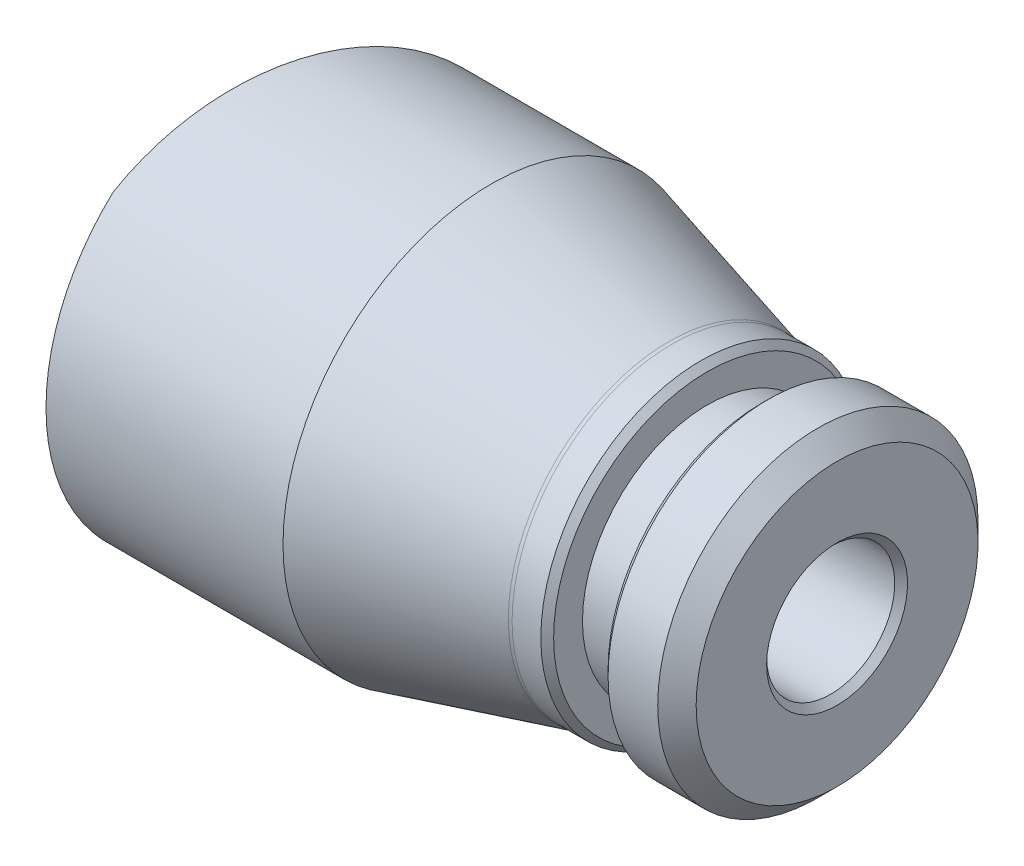
ISO-10303-21;
HEADER;
FILE_DESCRIPTION(('STEP AP214'),'2;1');
FILE_NAME('part.step','',(''),(''),'','','');
FILE_SCHEMA(('AUTOMOTIVE_DESIGN { 1 0 10303 214 1 1 1 1 }'));
ENDSEC;
DATA;
#1=APPLICATION_CONTEXT('core data for automotive mechanical design processes');
#2=APPLICATION_PROTOCOL_DEFINITION('international standard','automotive_design',2000,#1);
#3=PRODUCT_CONTEXT('',#1,'mechanical');
#4=PRODUCT('Part','Part','',(#3));
#5=PRODUCT_RELATED_PRODUCT_CATEGORY('part','',(#4));
#6=PRODUCT_DEFINITION_FORMATION('','',#4);
#7=PRODUCT_DEFINITION_CONTEXT('part definition',#1,'design');
#8=PRODUCT_DEFINITION('design','',#6,#7);
#9=PRODUCT_DEFINITION_SHAPE('','',#8);
#10=(LENGTH_UNIT() NAMED_UNIT(*) SI_UNIT(.MILLI.,.METRE.));
#11=(NAMED_UNIT(*) PLANE_ANGLE_UNIT() SI_UNIT($,.RADIAN.));
#12=(NAMED_UNIT(*) SI_UNIT($,.STERADIAN.) SOLID_ANGLE_UNIT());
#13=UNCERTAINTY_MEASURE_WITH_UNIT(LENGTH_MEASURE(1.E-05),#10,'distance_accuracy_value','');
#14=(GEOMETRIC_REPRESENTATION_CONTEXT(3) GLOBAL_UNCERTAINTY_ASSIGNED_CONTEXT((#13)) GLOBAL_UNIT_ASSIGNED_CONTEXT((#10,
#11,#12)) REPRESENTATION_CONTEXT('',''));
#15=CARTESIAN_POINT('',(0.,0.,0.));
#16=DIRECTION('',(0.,0.,1.));
#17=DIRECTION('',(1.,0.,0.));
#18=AXIS2_PLACEMENT_3D('',#15,#16,#17);
#19=CARTESIAN_POINT('',(0.,27.5,0.));
#20=DIRECTION('',(1.,0.,0.));
#21=DIRECTION('',(0.,0.,-1.));
#22=AXIS2_PLACEMENT_3D('',#19,#20,#21);
#23=PLANE('',#22);
#24=CARTESIAN_POINT('',(0.,0.,0.));
#25=DIRECTION('',(-1.,0.,0.));
#26=DIRECTION('',(0.,0.,1.));
#27=AXIS2_PLACEMENT_3D('',#24,#25,#26);
#28=CIRCLE('',#27,32.5);
#29=CARTESIAN_POINT('',(0.,-23.9217474278114,22.));
#30=VERTEX_POINT('',#29);
#31=CARTESIAN_POINT('',(0.,23.9217474278114,22.));
#32=VERTEX_POINT('',#31);
#33=EDGE_CURVE('E69',#30,#32,#28,.T.);
#34=ORIENTED_EDGE('',*,*,#33,.T.);
#35=DIRECTION('',(0.,-1.,0.));
#36=VECTOR('',#35,1.);
#37=CARTESIAN_POINT('',(0.,27.5,22.));
#38=LINE('',#37,#36);
#39=CARTESIAN_POINT('',(0.,16.5,22.));
#40=VERTEX_POINT('',#39);
#41=EDGE_CURVE('E60',#32,#40,#38,.T.);
#42=ORIENTED_EDGE('',*,*,#41,.T.);
#43=CARTESIAN_POINT('',(0.,0.,0.));
#44=DIRECTION('',(-1.,0.,0.));
#45=DIRECTION('',(0.,0.,1.));
#46=AXIS2_PLACEMENT_3D('',#43,#44,#45);
#47=CIRCLE('',#46,27.5);
#48=CARTESIAN_POINT('',(0.,-16.5,22.));
#49=VERTEX_POINT('',#48);
#50=EDGE_CURVE('E46',#49,#40,#47,.T.);
#51=ORIENTED_EDGE('',*,*,#50,.F.);
#52=EDGE_CURVE('E65',#49,#30,#38,.T.);
#53=ORIENTED_EDGE('',*,*,#52,.T.);
#54=EDGE_LOOP('',(#34,#42,#51,#53));
#55=FACE_BOUND('',#54,.T.);
#56=ADVANCED_FACE('F39',(#55),#23,.F.);
#57=CARTESIAN_POINT('',(0.,0.,0.));
#58=DIRECTION('',(-1.,0.,0.));
#59=DIRECTION('',(0.,0.,1.));
#60=AXIS2_PLACEMENT_3D('',#57,#58,#59);
#61=CYLINDRICAL_SURFACE('',#60,27.5);
#62=CARTESIAN_POINT('',(24.6,0.,0.));
#63=DIRECTION('',(-1.,0.,0.));
#64=DIRECTION('',(0.,0.,1.));
#65=AXIS2_PLACEMENT_3D('',#62,#63,#64);
#66=CIRCLE('',#65,27.5);
#67=CARTESIAN_POINT('',(24.6,0.,27.5));
#68=VERTEX_POINT('',#67);
#69=EDGE_CURVE('E132',#68,#68,#66,.T.);
#70=ORIENTED_EDGE('',*,*,#69,.F.);
#71=EDGE_LOOP('',(#70));
#72=FACE_BOUND('',#71,.T.);
#73=ORIENTED_EDGE('',*,*,#50,.T.);
#74=CARTESIAN_POINT('',(4.67624435674049,0.,0.));
#75=DIRECTION('',(0.978147600733805,0.,0.207911690817759));
#76=DIRECTION('',(-0.207911690817759,0.,0.978147600733806));
#77=AXIS2_PLACEMENT_3D('',#74,#75,#76);
#78=ELLIPSE('',#77,28.1143663587883,27.5);
#79=EDGE_CURVE('E52',#40,#49,#78,.F.);
#80=ORIENTED_EDGE('',*,*,#79,.T.);
#81=EDGE_LOOP('',(#73,#80));
#82=FACE_BOUND('',#81,.T.);
#83=ADVANCED_FACE('F131',(#72,#82),#61,.F.);
#84=CARTESIAN_POINT('',(24.6,0.,0.));
#85=DIRECTION('',(-1.,0.,0.));
#86=DIRECTION('',(0.,0.,1.));
#87=AXIS2_PLACEMENT_3D('',#84,#85,#86);
#88=TOROIDAL_SURFACE('',#87,27.1,0.399999999999999);
#89=CARTESIAN_POINT('',(25.,0.,0.));
#90=DIRECTION('',(-1.,0.,0.));
#91=DIRECTION('',(0.,0.,1.));
#92=AXIS2_PLACEMENT_3D('',#89,#90,#91);
#93=CIRCLE('',#92,27.1);
#94=CARTESIAN_POINT('',(25.,0.,27.1));
#95=VERTEX_POINT('',#94);
#96=EDGE_CURVE('E126',#95,#95,#93,.T.);
#97=ORIENTED_EDGE('',*,*,#96,.F.);
#98=EDGE_LOOP('',(#97));
#99=FACE_BOUND('',#98,.T.);
#100=ORIENTED_EDGE('',*,*,#69,.T.);
#101=EDGE_LOOP('',(#100));
#102=FACE_BOUND('',#101,.T.);
#103=ADVANCED_FACE('F137',(#99,#102),#88,.F.);
#104=CARTESIAN_POINT('',(25.,20.,0.));
#105=DIRECTION('',(1.,0.,0.));
#106=DIRECTION('',(0.,0.,-1.));
#107=AXIS2_PLACEMENT_3D('',#104,#105,#106);
#108=PLANE('',#107);
#109=CARTESIAN_POINT('',(25.,0.,0.));
#110=DIRECTION('',(-1.,0.,0.));
#111=DIRECTION('',(0.,0.,1.));
#112=AXIS2_PLACEMENT_3D('',#109,#110,#111);
#113=CIRCLE('',#112,20.);
#114=CARTESIAN_POINT('',(25.,0.,20.));
#115=VERTEX_POINT('',#114);
#116=EDGE_CURVE('E121',#115,#115,#113,.T.);
#117=ORIENTED_EDGE('',*,*,#116,.F.);
#118=EDGE_LOOP('',(#117));
#119=FACE_BOUND('',#118,.T.);
#120=ORIENTED_EDGE('',*,*,#96,.T.);
#121=EDGE_LOOP('',(#120));
#122=FACE_BOUND('',#121,.T.);
#123=ADVANCED_FACE('F141',(#119,#122),#108,.F.);
#124=CARTESIAN_POINT('',(0.,0.,0.));
#125=DIRECTION('',(-1.,0.,0.));
#126=DIRECTION('',(0.,0.,1.));
#127=AXIS2_PLACEMENT_3D('',#124,#125,#126);
#128=CYLINDRICAL_SURFACE('',#127,20.);
#129=CARTESIAN_POINT('',(60.,0.,0.));
#130=DIRECTION('',(-1.,0.,0.));
#131=DIRECTION('',(0.,0.,1.));
#132=AXIS2_PLACEMENT_3D('',#129,#130,#131);
#133=CIRCLE('',#132,20.);
#134=CARTESIAN_POINT('',(60.,0.,20.));
#135=VERTEX_POINT('',#134);
#136=EDGE_CURVE('E125',#135,#135,#133,.T.);
#137=ORIENTED_EDGE('',*,*,#136,.F.);
#138=EDGE_LOOP('',(#137));
#139=FACE_BOUND('',#138,.T.);
#140=ORIENTED_EDGE('',*,*,#116,.T.);
#141=EDGE_LOOP('',(#140));
#142=FACE_BOUND('',#141,.T.);
#143=ADVANCED_FACE('F147',(#139,#142),#128,.F.);
#144=CARTESIAN_POINT('',(60.,0.,0.));
#145=DIRECTION('',(-1.,0.,0.));
#146=DIRECTION('',(0.,0.,1.));
#147=AXIS2_PLACEMENT_3D('',#144,#145,#146);
#148=TOROIDAL_SURFACE('',#147,19.,1.);
#149=CARTESIAN_POINT('',(61.,0.,0.));
#150=DIRECTION('',(-1.,0.,0.));
#151=DIRECTION('',(0.,0.,1.));
#152=AXIS2_PLACEMENT_3D('',#149,#150,#151);
#153=CIRCLE('',#152,19.);
#154=CARTESIAN_POINT('',(61.,0.,19.));
#155=VERTEX_POINT('',#154);
#156=EDGE_CURVE('E116',#155,#155,#153,.T.);
#157=ORIENTED_EDGE('',*,*,#156,.F.);
#158=EDGE_LOOP('',(#157));
#159=FACE_BOUND('',#158,.T.);
#160=ORIENTED_EDGE('',*,*,#136,.T.);
#161=EDGE_LOOP('',(#160));
#162=FACE_BOUND('',#161,.T.);
#163=ADVANCED_FACE('F152',(#159,#162),#148,.F.);
#164=CARTESIAN_POINT('',(61.,10.,0.));
#165=DIRECTION('',(1.,0.,0.));
#166=DIRECTION('',(0.,0.,-1.));
#167=AXIS2_PLACEMENT_3D('',#164,#165,#166);
#168=PLANE('',#167);
#169=CARTESIAN_POINT('',(61.,0.,0.));
#170=DIRECTION('',(-1.,0.,0.));
#171=DIRECTION('',(0.,0.,1.));
#172=AXIS2_PLACEMENT_3D('',#169,#170,#171);
#173=CIRCLE('',#172,10.);
#174=CARTESIAN_POINT('',(61.,0.,10.));
#175=VERTEX_POINT('',#174);
#176=EDGE_CURVE('E117',#175,#175,#173,.T.);
#177=ORIENTED_EDGE('',*,*,#176,.F.);
#178=EDGE_LOOP('',(#177));
#179=FACE_BOUND('',#178,.T.);
#180=ORIENTED_EDGE('',*,*,#156,.T.);
#181=EDGE_LOOP('',(#180));
#182=FACE_BOUND('',#181,.T.);
#183=ADVANCED_FACE('F158',(#179,#182),#168,.F.);
#184=CARTESIAN_POINT('',(0.,0.,0.));
#185=DIRECTION('',(-1.,0.,0.));
#186=DIRECTION('',(0.,0.,1.));
#187=AXIS2_PLACEMENT_3D('',#184,#185,#186);
#188=CYLINDRICAL_SURFACE('',#187,10.);
#189=CARTESIAN_POINT('',(90.,0.,0.));
#190=DIRECTION('',(-1.,0.,0.));
#191=DIRECTION('',(0.,0.,1.));
#192=AXIS2_PLACEMENT_3D('',#189,#190,#191);
#193=CIRCLE('',#192,10.);
#194=CARTESIAN_POINT('',(90.,0.,10.));
#195=VERTEX_POINT('',#194);
#196=EDGE_CURVE('E114',#195,#195,#193,.T.);
#197=ORIENTED_EDGE('',*,*,#196,.F.);
#198=EDGE_LOOP('',(#197));
#199=FACE_BOUND('',#198,.T.);
#200=ORIENTED_EDGE('',*,*,#176,.T.);
#201=EDGE_LOOP('',(#200));
#202=FACE_BOUND('',#201,.T.);
#203=ADVANCED_FACE('F165',(#199,#202),#188,.F.);
#204=CARTESIAN_POINT('',(90.,0.,0.));
#205=DIRECTION('',(1.,0.,0.));
#206=DIRECTION('',(0.,0.,-1.));
#207=AXIS2_PLACEMENT_3D('',#204,#205,#206);
#208=CONICAL_SURFACE('',#207,10.,0.785398163397447);
#209=CARTESIAN_POINT('',(91.,0.,0.));
#210=DIRECTION('',(-1.,0.,0.));
#211=DIRECTION('',(0.,0.,1.));
#212=AXIS2_PLACEMENT_3D('',#209,#210,#211);
#213=CIRCLE('',#212,11.);
#214=CARTESIAN_POINT('',(91.,0.,11.));
#215=VERTEX_POINT('',#214);
#216=EDGE_CURVE('E109',#215,#215,#213,.T.);
#217=ORIENTED_EDGE('',*,*,#216,.F.);
#218=EDGE_LOOP('',(#217));
#219=FACE_BOUND('',#218,.T.);
#220=ORIENTED_EDGE('',*,*,#196,.T.);
#221=EDGE_LOOP('',(#220));
#222=FACE_BOUND('',#221,.T.);
#223=ADVANCED_FACE('F167',(#219,#222),#208,.F.);
#224=CARTESIAN_POINT('',(91.,22.,0.));
#225=DIRECTION('',(-1.,0.,0.));
#226=DIRECTION('',(0.,0.,1.));
#227=AXIS2_PLACEMENT_3D('',#224,#225,#226);
#228=PLANE('',#227);
#229=CARTESIAN_POINT('',(91.,0.,0.));
#230=DIRECTION('',(-1.,0.,0.));
#231=DIRECTION('',(0.,0.,1.));
#232=AXIS2_PLACEMENT_3D('',#229,#230,#231);
#233=CIRCLE('',#232,22.);
#234=CARTESIAN_POINT('',(91.,0.,22.));
#235=VERTEX_POINT('',#234);
#236=EDGE_CURVE('E110',#235,#235,#233,.T.);
#237=ORIENTED_EDGE('',*,*,#236,.F.);
#238=EDGE_LOOP('',(#237));
#239=FACE_BOUND('',#238,.T.);
#240=ORIENTED_EDGE('',*,*,#216,.T.);
#241=EDGE_LOOP('',(#240));
#242=FACE_BOUND('',#241,.T.);
#243=ADVANCED_FACE('F168',(#239,#242),#228,.F.);
#244=CARTESIAN_POINT('',(91.,0.,0.));
#245=DIRECTION('',(-1.,0.,0.));
#246=DIRECTION('',(0.,0.,1.));
#247=AXIS2_PLACEMENT_3D('',#244,#245,#246);
#248=CONICAL_SURFACE('',#247,22.,0.785398163397448);
#249=CARTESIAN_POINT('',(88.,0.,0.));
#250=DIRECTION('',(-1.,0.,0.));
#251=DIRECTION('',(0.,0.,1.));
#252=AXIS2_PLACEMENT_3D('',#249,#250,#251);
#253=CIRCLE('',#252,25.);
#254=CARTESIAN_POINT('',(88.,0.,25.));
#255=VERTEX_POINT('',#254);
#256=EDGE_CURVE('E102',#255,#255,#253,.T.);
#257=ORIENTED_EDGE('',*,*,#256,.F.);
#258=EDGE_LOOP('',(#257));
#259=FACE_BOUND('',#258,.T.);
#260=ORIENTED_EDGE('',*,*,#236,.T.);
#261=EDGE_LOOP('',(#260));
#262=FACE_BOUND('',#261,.T.);
#263=ADVANCED_FACE('F171',(#259,#262),#248,.T.);
#264=CARTESIAN_POINT('',(0.,0.,0.));
#265=DIRECTION('',(-1.,0.,0.));
#266=DIRECTION('',(0.,0.,1.));
#267=AXIS2_PLACEMENT_3D('',#264,#265,#266);
#268=CYLINDRICAL_SURFACE('',#267,25.);
#269=CARTESIAN_POINT('',(80.25,0.,0.));
#270=DIRECTION('',(-1.,0.,0.));
#271=DIRECTION('',(0.,0.,1.));
#272=AXIS2_PLACEMENT_3D('',#269,#270,#271);
#273=CIRCLE('',#272,25.);
#274=CARTESIAN_POINT('',(80.25,0.,25.));
#275=VERTEX_POINT('',#274);
#276=EDGE_CURVE('E101',#275,#275,#273,.T.);
#277=ORIENTED_EDGE('',*,*,#276,.F.);
#278=EDGE_LOOP('',(#277));
#279=FACE_BOUND('',#278,.T.);
#280=ORIENTED_EDGE('',*,*,#256,.T.);
#281=EDGE_LOOP('',(#280));
#282=FACE_BOUND('',#281,.T.);
#283=ADVANCED_FACE('F178',(#279,#282),#268,.T.);
#284=CARTESIAN_POINT('',(80.25,0.,0.));
#285=DIRECTION('',(1.,0.,0.));
#286=DIRECTION('',(0.,0.,-1.));
#287=AXIS2_PLACEMENT_3D('',#284,#285,#286);
#288=CONICAL_SURFACE('',#287,25.,0.785398163397448);
#289=CARTESIAN_POINT('',(79.25,0.,0.));
#290=DIRECTION('',(-1.,0.,0.));
#291=DIRECTION('',(0.,0.,1.));
#292=AXIS2_PLACEMENT_3D('',#289,#290,#291);
#293=CIRCLE('',#292,24.);
#294=CARTESIAN_POINT('',(79.25,0.,24.));
#295=VERTEX_POINT('',#294);
#296=EDGE_CURVE('E98',#295,#295,#293,.T.);
#297=ORIENTED_EDGE('',*,*,#296,.F.);
#298=EDGE_LOOP('',(#297));
#299=FACE_BOUND('',#298,.T.);
#300=ORIENTED_EDGE('',*,*,#276,.T.);
#301=EDGE_LOOP('',(#300));
#302=FACE_BOUND('',#301,.T.);
#303=ADVANCED_FACE('F185',(#299,#302),#288,.T.);
#304=CARTESIAN_POINT('',(79.25,19.4999958169038,0.));
#305=DIRECTION('',(1.,0.,0.));
#306=DIRECTION('',(0.,0.,-1.));
#307=AXIS2_PLACEMENT_3D('',#304,#305,#306);
#308=PLANE('',#307);
#309=CARTESIAN_POINT('',(79.25,0.,0.));
#310=DIRECTION('',(-1.,0.,0.));
#311=DIRECTION('',(0.,0.,1.));
#312=AXIS2_PLACEMENT_3D('',#309,#310,#311);
#313=CIRCLE('',#312,19.4999958169038);
#314=CARTESIAN_POINT('',(79.25,0.,19.4999958169038));
#315=VERTEX_POINT('',#314);
#316=EDGE_CURVE('E92',#315,#315,#313,.T.);
#317=ORIENTED_EDGE('',*,*,#316,.F.);
#318=EDGE_LOOP('',(#317));
#319=FACE_BOUND('',#318,.T.);
#320=ORIENTED_EDGE('',*,*,#296,.T.);
#321=EDGE_LOOP('',(#320));
#322=FACE_BOUND('',#321,.T.);
#323=ADVANCED_FACE('F187',(#319,#322),#308,.F.);
#324=CARTESIAN_POINT('',(0.,0.,0.));
#325=DIRECTION('',(-1.,0.,0.));
#326=DIRECTION('',(0.,0.,1.));
#327=AXIS2_PLACEMENT_3D('',#324,#325,#326);
#328=CYLINDRICAL_SURFACE('',#327,19.4999958169038);
#329=CARTESIAN_POINT('',(70.7499994494134,0.,0.));
#330=DIRECTION('',(-1.,0.,0.));
#331=DIRECTION('',(0.,0.,1.));
#332=AXIS2_PLACEMENT_3D('',#329,#330,#331);
#333=CIRCLE('',#332,19.4999958169038);
#334=CARTESIAN_POINT('',(70.7499994494134,0.,19.4999958169038));
#335=VERTEX_POINT('',#334);
#336=EDGE_CURVE('E95',#335,#335,#333,.T.);
#337=ORIENTED_EDGE('',*,*,#336,.F.);
#338=EDGE_LOOP('',(#337));
#339=FACE_BOUND('',#338,.T.);
#340=ORIENTED_EDGE('',*,*,#316,.T.);
#341=EDGE_LOOP('',(#340));
#342=FACE_BOUND('',#341,.T.);
#343=ADVANCED_FACE('F188',(#339,#342),#328,.T.);
#344=CARTESIAN_POINT('',(70.7499994494134,23.9999958169038,0.));
#345=DIRECTION('',(-1.,0.,0.));
#346=DIRECTION('',(0.,0.,1.));
#347=AXIS2_PLACEMENT_3D('',#344,#345,#346);
#348=PLANE('',#347);
#349=CARTESIAN_POINT('',(70.7499994494134,0.,0.));
#350=DIRECTION('',(-1.,0.,0.));
#351=DIRECTION('',(0.,0.,1.));
#352=AXIS2_PLACEMENT_3D('',#349,#350,#351);
#353=CIRCLE('',#352,23.9999958169038);
#354=CARTESIAN_POINT('',(70.7499994494134,0.,23.9999958169038));
#355=VERTEX_POINT('',#354);
#356=EDGE_CURVE('E90',#355,#355,#353,.T.);
#357=ORIENTED_EDGE('',*,*,#356,.F.);
#358=EDGE_LOOP('',(#357));
#359=FACE_BOUND('',#358,.T.);
#360=ORIENTED_EDGE('',*,*,#336,.T.);
#361=EDGE_LOOP('',(#360));
#362=FACE_BOUND('',#361,.T.);
#363=ADVANCED_FACE('F191',(#359,#362),#348,.F.);
#364=CARTESIAN_POINT('',(70.7499994494134,0.,0.));
#365=DIRECTION('',(-1.,0.,0.));
#366=DIRECTION('',(0.,0.,1.));
#367=AXIS2_PLACEMENT_3D('',#364,#365,#366);
#368=CONICAL_SURFACE('',#367,23.9999958169038,0.785398163397452);
#369=CARTESIAN_POINT('',(69.7499994494134,0.,0.));
#370=DIRECTION('',(-1.,0.,0.));
#371=DIRECTION('',(0.,0.,1.));
#372=AXIS2_PLACEMENT_3D('',#369,#370,#371);
#373=CIRCLE('',#372,24.9999958169038);
#374=CARTESIAN_POINT('',(69.7499994494134,0.,24.9999958169038));
#375=VERTEX_POINT('',#374);
#376=EDGE_CURVE('E88',#375,#375,#373,.T.);
#377=ORIENTED_EDGE('',*,*,#376,.F.);
#378=EDGE_LOOP('',(#377));
#379=FACE_BOUND('',#378,.T.);
#380=ORIENTED_EDGE('',*,*,#356,.T.);
#381=EDGE_LOOP('',(#380));
#382=FACE_BOUND('',#381,.T.);
#383=ADVANCED_FACE('F196',(#379,#382),#368,.T.);
#384=CARTESIAN_POINT('',(0.,0.,0.));
#385=DIRECTION('',(-1.,0.,0.));
#386=DIRECTION('',(0.,0.,1.));
#387=AXIS2_PLACEMENT_3D('',#384,#385,#386);
#388=CYLINDRICAL_SURFACE('',#387,24.9999958169038);
#389=CARTESIAN_POINT('',(65.2632170494134,0.,0.));
#390=DIRECTION('',(-1.,0.,0.));
#391=DIRECTION('',(0.,0.,1.));
#392=AXIS2_PLACEMENT_3D('',#389,#390,#391);
#393=CIRCLE('',#392,24.9999958169038);
#394=CARTESIAN_POINT('',(65.2632170494134,0.,24.9999958169038));
#395=VERTEX_POINT('',#394);
#396=EDGE_CURVE('E85',#395,#395,#393,.T.);
#397=ORIENTED_EDGE('',*,*,#396,.F.);
#398=EDGE_LOOP('',(#397));
#399=FACE_BOUND('',#398,.T.);
#400=ORIENTED_EDGE('',*,*,#376,.T.);
#401=EDGE_LOOP('',(#400));
#402=FACE_BOUND('',#401,.T.);
#403=ADVANCED_FACE('F205',(#399,#402),#388,.T.);
#404=CARTESIAN_POINT('',(65.2632170494134,0.,0.));
#405=DIRECTION('',(-1.,0.,0.));
#406=DIRECTION('',(0.,0.,1.));
#407=AXIS2_PLACEMENT_3D('',#404,#405,#406);
#408=TOROIDAL_SURFACE('',#407,26.9999979446865,2.00000212778271);
#409=CARTESIAN_POINT('',(64.745695,0.,0.));
#410=DIRECTION('',(-1.,0.,0.));
#411=DIRECTION('',(0.,0.,1.));
#412=AXIS2_PLACEMENT_3D('',#409,#410,#411);
#413=CIRCLE('',#412,25.068113);
#414=CARTESIAN_POINT('',(64.745695,0.,25.068113));
#415=VERTEX_POINT('',#414);
#416=EDGE_CURVE('E79',#415,#415,#413,.T.);
#417=ORIENTED_EDGE('',*,*,#416,.F.);
#418=EDGE_LOOP('',(#417));
#419=FACE_BOUND('',#418,.T.);
#420=ORIENTED_EDGE('',*,*,#396,.T.);
#421=EDGE_LOOP('',(#420));
#422=FACE_BOUND('',#421,.T.);
#423=ADVANCED_FACE('F206',(#419,#422),#408,.F.);
#424=CARTESIAN_POINT('',(64.745695,0.,0.));
#425=DIRECTION('',(-1.,0.,0.));
#426=DIRECTION('',(0.,0.,1.));
#427=AXIS2_PLACEMENT_3D('',#424,#425,#426);
#428=CONICAL_SURFACE('',#427,25.068113,0.26171365072842);
#429=CARTESIAN_POINT('',(37.,0.,0.));
#430=DIRECTION('',(-1.,0.,0.));
#431=DIRECTION('',(0.,0.,1.));
#432=AXIS2_PLACEMENT_3D('',#429,#430,#431);
#433=CIRCLE('',#432,32.5);
#434=CARTESIAN_POINT('',(37.,0.,32.5));
#435=VERTEX_POINT('',#434);
#436=EDGE_CURVE('E74',#435,#435,#433,.T.);
#437=ORIENTED_EDGE('',*,*,#436,.F.);
#438=EDGE_LOOP('',(#437));
#439=FACE_BOUND('',#438,.T.);
#440=ORIENTED_EDGE('',*,*,#416,.T.);
#441=EDGE_LOOP('',(#440));
#442=FACE_BOUND('',#441,.T.);
#443=ADVANCED_FACE('F209',(#439,#442),#428,.T.);
#444=CARTESIAN_POINT('',(0.,0.,0.));
#445=DIRECTION('',(-1.,0.,0.));
#446=DIRECTION('',(0.,0.,1.));
#447=AXIS2_PLACEMENT_3D('',#444,#445,#446);
#448=CYLINDRICAL_SURFACE('',#447,32.5);
#449=ORIENTED_EDGE('',*,*,#33,.F.);
#450=CARTESIAN_POINT('',(4.67624435674049,0.,0.));
#451=DIRECTION('',(0.978147600733805,0.,0.207911690817759));
#452=DIRECTION('',(-0.207911690817759,0.,0.978147600733806));
#453=AXIS2_PLACEMENT_3D('',#450,#451,#452);
#454=ELLIPSE('',#453,33.2260693331135,32.5);
#455=EDGE_CURVE('E11',#30,#32,#454,.T.);
#456=ORIENTED_EDGE('',*,*,#455,.T.);
#457=EDGE_LOOP('',(#449,#456));
#458=FACE_BOUND('',#457,.T.);
#459=ORIENTED_EDGE('',*,*,#436,.T.);
#460=EDGE_LOOP('',(#459));
#461=FACE_BOUND('',#460,.T.);
#462=ADVANCED_FACE('F75',(#458,#461),#448,.T.);
#463=CARTESIAN_POINT('',(15.3040724402416,-32.5,-50.));
#464=DIRECTION('',(0.978147600733805,0.,0.207911690817759));
#465=DIRECTION('',(0.207911690817759,0.,-0.978147600733806));
#466=AXIS2_PLACEMENT_3D('',#463,#464,#465);
#467=PLANE('',#466);
#468=ORIENTED_EDGE('',*,*,#455,.F.);
#469=ORIENTED_EDGE('',*,*,#52,.F.);
#470=ORIENTED_EDGE('',*,*,#79,.F.);
#471=ORIENTED_EDGE('',*,*,#41,.F.);
#472=EDGE_LOOP('',(#468,#469,#470,#471));
#473=FACE_BOUND('',#472,.T.);
#474=ADVANCED_FACE('F64',(#473),#467,.F.);
#475=CLOSED_SHELL('',(#56,#83,#103,#123,#143,#163,#183,#203,#223,#243,#263,#283,#303,#323,#343,
#363,#383,#403,#423,#443,#462,#474));
#476=MANIFOLD_SOLID_BREP('B2',#475);
#477=ADVANCED_BREP_SHAPE_REPRESENTATION('',(#18,#476),#14);
#478=SHAPE_DEFINITION_REPRESENTATION(#9,#477);
ENDSEC;
END-ISO-10303-21;
